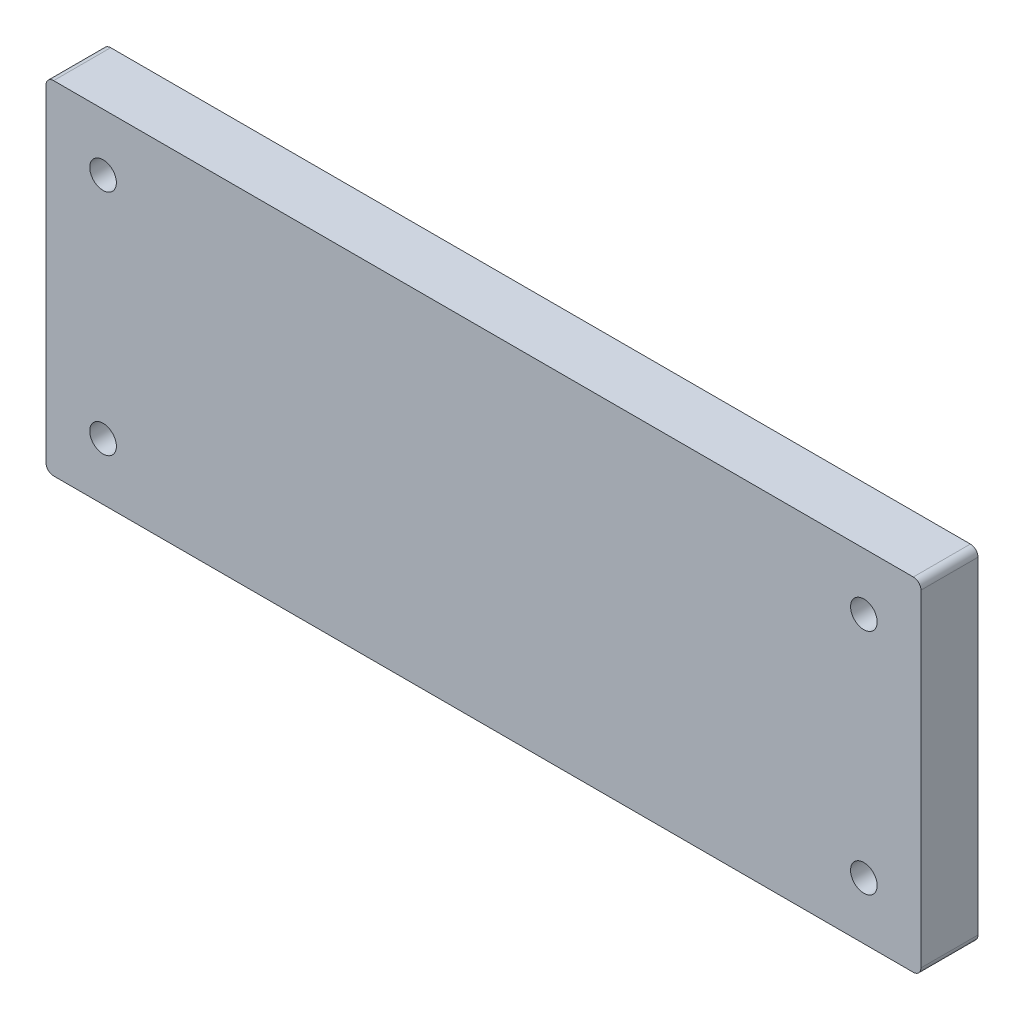
ISO-10303-21;
HEADER;
FILE_DESCRIPTION(('STEP AP214'),'2;1');
FILE_NAME('part.step','',(''),(''),'','','');
FILE_SCHEMA(('AUTOMOTIVE_DESIGN { 1 0 10303 214 1 1 1 1 }'));
ENDSEC;
DATA;
#1=APPLICATION_CONTEXT('core data for automotive mechanical design processes');
#2=APPLICATION_PROTOCOL_DEFINITION('international standard','automotive_design',2000,#1);
#3=PRODUCT_CONTEXT('',#1,'mechanical');
#4=PRODUCT('Part','Part','',(#3));
#5=PRODUCT_RELATED_PRODUCT_CATEGORY('part','',(#4));
#6=PRODUCT_DEFINITION_FORMATION('','',#4);
#7=PRODUCT_DEFINITION_CONTEXT('part definition',#1,'design');
#8=PRODUCT_DEFINITION('design','',#6,#7);
#9=PRODUCT_DEFINITION_SHAPE('','',#8);
#10=(LENGTH_UNIT() NAMED_UNIT(*) SI_UNIT(.MILLI.,.METRE.));
#11=(NAMED_UNIT(*) PLANE_ANGLE_UNIT() SI_UNIT($,.RADIAN.));
#12=(NAMED_UNIT(*) SI_UNIT($,.STERADIAN.) SOLID_ANGLE_UNIT());
#13=UNCERTAINTY_MEASURE_WITH_UNIT(LENGTH_MEASURE(1.E-05),#10,'distance_accuracy_value','');
#14=(GEOMETRIC_REPRESENTATION_CONTEXT(3) GLOBAL_UNCERTAINTY_ASSIGNED_CONTEXT((#13)) GLOBAL_UNIT_ASSIGNED_CONTEXT((#10,
#11,#12)) REPRESENTATION_CONTEXT('',''));
#15=CARTESIAN_POINT('',(0.,0.,0.));
#16=DIRECTION('',(0.,0.,1.));
#17=DIRECTION('',(1.,0.,0.));
#18=AXIS2_PLACEMENT_3D('',#15,#16,#17);
#19=CARTESIAN_POINT('',(-115.,45.,15.));
#20=DIRECTION('',(1.,0.,0.));
#21=DIRECTION('',(0.,1.,0.));
#22=AXIS2_PLACEMENT_3D('',#19,#20,#21);
#23=PLANE('',#22);
#24=DIRECTION('',(0.,-1.,0.));
#25=VECTOR('',#24,1.);
#26=CARTESIAN_POINT('',(-115.,45.,0.));
#27=LINE('',#26,#25);
#28=CARTESIAN_POINT('',(-115.,43.,0.));
#29=VERTEX_POINT('',#28);
#30=CARTESIAN_POINT('',(-115.,-43.,0.));
#31=VERTEX_POINT('',#30);
#32=EDGE_CURVE('E176',#29,#31,#27,.T.);
#33=ORIENTED_EDGE('',*,*,#32,.T.);
#34=DIRECTION('',(0.,0.,-1.));
#35=VECTOR('',#34,1.);
#36=CARTESIAN_POINT('',(-115.,-43.,15.));
#37=LINE('',#36,#35);
#38=CARTESIAN_POINT('',(-115.,-43.,15.));
#39=VERTEX_POINT('',#38);
#40=EDGE_CURVE('E11',#31,#39,#37,.F.);
#41=ORIENTED_EDGE('',*,*,#40,.T.);
#42=DIRECTION('',(0.,-1.,0.));
#43=VECTOR('',#42,1.);
#44=CARTESIAN_POINT('',(-115.,45.,15.));
#45=LINE('',#44,#43);
#46=CARTESIAN_POINT('',(-115.,43.,15.));
#47=VERTEX_POINT('',#46);
#48=EDGE_CURVE('E130',#47,#39,#45,.T.);
#49=ORIENTED_EDGE('',*,*,#48,.F.);
#50=DIRECTION('',(0.,0.,-1.));
#51=VECTOR('',#50,1.);
#52=CARTESIAN_POINT('',(-115.,43.,15.));
#53=LINE('',#52,#51);
#54=EDGE_CURVE('E147',#47,#29,#53,.T.);
#55=ORIENTED_EDGE('',*,*,#54,.T.);
#56=EDGE_LOOP('',(#33,#41,#49,#55));
#57=FACE_BOUND('',#56,.T.);
#58=ADVANCED_FACE('F37',(#57),#23,.F.);
#59=CARTESIAN_POINT('',(-115.,-45.,15.));
#60=DIRECTION('',(0.,1.,0.));
#61=DIRECTION('',(0.,0.,1.));
#62=AXIS2_PLACEMENT_3D('',#59,#60,#61);
#63=PLANE('',#62);
#64=DIRECTION('',(1.,0.,0.));
#65=VECTOR('',#64,1.);
#66=CARTESIAN_POINT('',(-115.,-45.,0.));
#67=LINE('',#66,#65);
#68=CARTESIAN_POINT('',(-113.,-45.,0.));
#69=VERTEX_POINT('',#68);
#70=CARTESIAN_POINT('',(113.,-45.,0.));
#71=VERTEX_POINT('',#70);
#72=EDGE_CURVE('E136',#69,#71,#67,.T.);
#73=ORIENTED_EDGE('',*,*,#72,.T.);
#74=DIRECTION('',(0.,0.,-1.));
#75=VECTOR('',#74,1.);
#76=CARTESIAN_POINT('',(113.,-45.,15.));
#77=LINE('',#76,#75);
#78=CARTESIAN_POINT('',(113.,-45.,15.));
#79=VERTEX_POINT('',#78);
#80=EDGE_CURVE('E58',#71,#79,#77,.F.);
#81=ORIENTED_EDGE('',*,*,#80,.T.);
#82=DIRECTION('',(1.,0.,0.));
#83=VECTOR('',#82,1.);
#84=CARTESIAN_POINT('',(-115.,-45.,15.));
#85=LINE('',#84,#83);
#86=CARTESIAN_POINT('',(-113.,-45.,15.));
#87=VERTEX_POINT('',#86);
#88=EDGE_CURVE('E134',#87,#79,#85,.T.);
#89=ORIENTED_EDGE('',*,*,#88,.F.);
#90=DIRECTION('',(0.,0.,-1.));
#91=VECTOR('',#90,1.);
#92=CARTESIAN_POINT('',(-113.,-45.,15.));
#93=LINE('',#92,#91);
#94=EDGE_CURVE('E157',#87,#69,#93,.T.);
#95=ORIENTED_EDGE('',*,*,#94,.T.);
#96=EDGE_LOOP('',(#73,#81,#89,#95));
#97=FACE_BOUND('',#96,.T.);
#98=ADVANCED_FACE('F174',(#97),#63,.F.);
#99=CARTESIAN_POINT('',(115.,45.,15.));
#100=DIRECTION('',(-1.,0.,0.));
#101=DIRECTION('',(0.,-1.,0.));
#102=AXIS2_PLACEMENT_3D('',#99,#100,#101);
#103=PLANE('',#102);
#104=DIRECTION('',(0.,1.,0.));
#105=VECTOR('',#104,1.);
#106=CARTESIAN_POINT('',(115.,45.,15.));
#107=LINE('',#106,#105);
#108=CARTESIAN_POINT('',(115.,-43.,15.));
#109=VERTEX_POINT('',#108);
#110=CARTESIAN_POINT('',(115.,43.,15.));
#111=VERTEX_POINT('',#110);
#112=EDGE_CURVE('E166',#109,#111,#107,.T.);
#113=ORIENTED_EDGE('',*,*,#112,.F.);
#114=DIRECTION('',(0.,0.,-1.));
#115=VECTOR('',#114,1.);
#116=CARTESIAN_POINT('',(115.,-43.,15.));
#117=LINE('',#116,#115);
#118=CARTESIAN_POINT('',(115.,-43.,0.));
#119=VERTEX_POINT('',#118);
#120=EDGE_CURVE('E150',#109,#119,#117,.T.);
#121=ORIENTED_EDGE('',*,*,#120,.T.);
#122=DIRECTION('',(0.,1.,0.));
#123=VECTOR('',#122,1.);
#124=CARTESIAN_POINT('',(115.,45.,0.));
#125=LINE('',#124,#123);
#126=CARTESIAN_POINT('',(115.,43.,0.));
#127=VERTEX_POINT('',#126);
#128=EDGE_CURVE('E131',#119,#127,#125,.T.);
#129=ORIENTED_EDGE('',*,*,#128,.T.);
#130=DIRECTION('',(0.,0.,-1.));
#131=VECTOR('',#130,1.);
#132=CARTESIAN_POINT('',(115.,43.,15.));
#133=LINE('',#132,#131);
#134=EDGE_CURVE('E111',#127,#111,#133,.F.);
#135=ORIENTED_EDGE('',*,*,#134,.T.);
#136=EDGE_LOOP('',(#113,#121,#129,#135));
#137=FACE_BOUND('',#136,.T.);
#138=ADVANCED_FACE('F170',(#137),#103,.F.);
#139=CARTESIAN_POINT('',(-115.,45.,15.));
#140=DIRECTION('',(0.,-1.,0.));
#141=DIRECTION('',(1.,0.,0.));
#142=AXIS2_PLACEMENT_3D('',#139,#140,#141);
#143=PLANE('',#142);
#144=DIRECTION('',(-1.,0.,0.));
#145=VECTOR('',#144,1.);
#146=CARTESIAN_POINT('',(-115.,45.,15.));
#147=LINE('',#146,#145);
#148=CARTESIAN_POINT('',(113.,45.,15.));
#149=VERTEX_POINT('',#148);
#150=CARTESIAN_POINT('',(-113.,45.,15.));
#151=VERTEX_POINT('',#150);
#152=EDGE_CURVE('E124',#149,#151,#147,.T.);
#153=ORIENTED_EDGE('',*,*,#152,.F.);
#154=DIRECTION('',(0.,0.,-1.));
#155=VECTOR('',#154,1.);
#156=CARTESIAN_POINT('',(113.,45.,15.));
#157=LINE('',#156,#155);
#158=CARTESIAN_POINT('',(113.,45.,0.));
#159=VERTEX_POINT('',#158);
#160=EDGE_CURVE('E109',#149,#159,#157,.T.);
#161=ORIENTED_EDGE('',*,*,#160,.T.);
#162=DIRECTION('',(-1.,0.,0.));
#163=VECTOR('',#162,1.);
#164=CARTESIAN_POINT('',(-115.,45.,0.));
#165=LINE('',#164,#163);
#166=CARTESIAN_POINT('',(-113.,45.,0.));
#167=VERTEX_POINT('',#166);
#168=EDGE_CURVE('E121',#159,#167,#165,.T.);
#169=ORIENTED_EDGE('',*,*,#168,.T.);
#170=DIRECTION('',(0.,0.,-1.));
#171=VECTOR('',#170,1.);
#172=CARTESIAN_POINT('',(-113.,45.,15.));
#173=LINE('',#172,#171);
#174=EDGE_CURVE('E125',#167,#151,#173,.F.);
#175=ORIENTED_EDGE('',*,*,#174,.T.);
#176=EDGE_LOOP('',(#153,#161,#169,#175));
#177=FACE_BOUND('',#176,.T.);
#178=ADVANCED_FACE('F120',(#177),#143,.F.);
#179=CARTESIAN_POINT('',(0.,0.,15.));
#180=DIRECTION('',(0.,0.,1.));
#181=DIRECTION('',(1.,0.,0.));
#182=AXIS2_PLACEMENT_3D('',#179,#180,#181);
#183=PLANE('',#182);
#184=CARTESIAN_POINT('',(100.,-30.,15.));
#185=DIRECTION('',(0.,0.,1.));
#186=DIRECTION('',(1.,0.,0.));
#187=AXIS2_PLACEMENT_3D('',#184,#185,#186);
#188=CIRCLE('',#187,3.49999999999999);
#189=CARTESIAN_POINT('',(103.5,-30.,15.));
#190=VERTEX_POINT('',#189);
#191=EDGE_CURVE('E202',#190,#190,#188,.T.);
#192=ORIENTED_EDGE('',*,*,#191,.F.);
#193=EDGE_LOOP('',(#192));
#194=FACE_BOUND('',#193,.T.);
#195=CARTESIAN_POINT('',(-100.,-30.,15.));
#196=DIRECTION('',(0.,0.,1.));
#197=DIRECTION('',(1.,0.,0.));
#198=AXIS2_PLACEMENT_3D('',#195,#196,#197);
#199=CIRCLE('',#198,3.49999999999999);
#200=CARTESIAN_POINT('',(-96.5,-30.,15.));
#201=VERTEX_POINT('',#200);
#202=EDGE_CURVE('E196',#201,#201,#199,.T.);
#203=ORIENTED_EDGE('',*,*,#202,.F.);
#204=EDGE_LOOP('',(#203));
#205=FACE_BOUND('',#204,.T.);
#206=CARTESIAN_POINT('',(-100.,30.,15.));
#207=DIRECTION('',(0.,0.,1.));
#208=DIRECTION('',(1.,0.,0.));
#209=AXIS2_PLACEMENT_3D('',#206,#207,#208);
#210=CIRCLE('',#209,3.49999999999999);
#211=CARTESIAN_POINT('',(-96.5,30.,15.));
#212=VERTEX_POINT('',#211);
#213=EDGE_CURVE('E190',#212,#212,#210,.T.);
#214=ORIENTED_EDGE('',*,*,#213,.F.);
#215=EDGE_LOOP('',(#214));
#216=FACE_BOUND('',#215,.T.);
#217=CARTESIAN_POINT('',(100.,30.,15.));
#218=DIRECTION('',(0.,0.,1.));
#219=DIRECTION('',(1.,0.,0.));
#220=AXIS2_PLACEMENT_3D('',#217,#218,#219);
#221=CIRCLE('',#220,3.49999999999999);
#222=CARTESIAN_POINT('',(103.5,30.,15.));
#223=VERTEX_POINT('',#222);
#224=EDGE_CURVE('E184',#223,#223,#221,.T.);
#225=ORIENTED_EDGE('',*,*,#224,.F.);
#226=EDGE_LOOP('',(#225));
#227=FACE_BOUND('',#226,.T.);
#228=ORIENTED_EDGE('',*,*,#88,.T.);
#229=CARTESIAN_POINT('',(113.,-43.,15.));
#230=DIRECTION('',(0.,0.,1.));
#231=DIRECTION('',(1.,0.,0.));
#232=AXIS2_PLACEMENT_3D('',#229,#230,#231);
#233=CIRCLE('',#232,2.);
#234=EDGE_CURVE('E45',#79,#109,#233,.T.);
#235=ORIENTED_EDGE('',*,*,#234,.T.);
#236=ORIENTED_EDGE('',*,*,#112,.T.);
#237=CARTESIAN_POINT('',(113.,43.,15.));
#238=DIRECTION('',(0.,0.,1.));
#239=DIRECTION('',(1.,0.,0.));
#240=AXIS2_PLACEMENT_3D('',#237,#238,#239);
#241=CIRCLE('',#240,2.);
#242=EDGE_CURVE('E145',#111,#149,#241,.T.);
#243=ORIENTED_EDGE('',*,*,#242,.T.);
#244=ORIENTED_EDGE('',*,*,#152,.T.);
#245=CARTESIAN_POINT('',(-113.,43.,15.));
#246=DIRECTION('',(0.,0.,1.));
#247=DIRECTION('',(1.,0.,0.));
#248=AXIS2_PLACEMENT_3D('',#245,#246,#247);
#249=CIRCLE('',#248,2.);
#250=EDGE_CURVE('E143',#151,#47,#249,.T.);
#251=ORIENTED_EDGE('',*,*,#250,.T.);
#252=ORIENTED_EDGE('',*,*,#48,.T.);
#253=CARTESIAN_POINT('',(-113.,-43.,15.));
#254=DIRECTION('',(0.,0.,1.));
#255=DIRECTION('',(1.,0.,0.));
#256=AXIS2_PLACEMENT_3D('',#253,#254,#255);
#257=CIRCLE('',#256,2.);
#258=EDGE_CURVE('E161',#39,#87,#257,.T.);
#259=ORIENTED_EDGE('',*,*,#258,.T.);
#260=EDGE_LOOP('',(#228,#235,#236,#243,#244,#251,#252,#259));
#261=FACE_BOUND('',#260,.T.);
#262=ADVANCED_FACE('F165',(#194,#205,#216,#227,#261),#183,.T.);
#263=CARTESIAN_POINT('',(0.,0.,0.));
#264=DIRECTION('',(0.,0.,1.));
#265=DIRECTION('',(1.,0.,0.));
#266=AXIS2_PLACEMENT_3D('',#263,#264,#265);
#267=PLANE('',#266);
#268=CARTESIAN_POINT('',(100.,-30.,0.));
#269=DIRECTION('',(0.,0.,1.));
#270=DIRECTION('',(1.,0.,0.));
#271=AXIS2_PLACEMENT_3D('',#268,#269,#270);
#272=CIRCLE('',#271,3.49999999999999);
#273=CARTESIAN_POINT('',(103.5,-30.,0.));
#274=VERTEX_POINT('',#273);
#275=EDGE_CURVE('E199',#274,#274,#272,.T.);
#276=ORIENTED_EDGE('',*,*,#275,.T.);
#277=EDGE_LOOP('',(#276));
#278=FACE_BOUND('',#277,.T.);
#279=CARTESIAN_POINT('',(-100.,-30.,0.));
#280=DIRECTION('',(0.,0.,1.));
#281=DIRECTION('',(1.,0.,0.));
#282=AXIS2_PLACEMENT_3D('',#279,#280,#281);
#283=CIRCLE('',#282,3.49999999999999);
#284=CARTESIAN_POINT('',(-96.5,-30.,0.));
#285=VERTEX_POINT('',#284);
#286=EDGE_CURVE('E193',#285,#285,#283,.T.);
#287=ORIENTED_EDGE('',*,*,#286,.T.);
#288=EDGE_LOOP('',(#287));
#289=FACE_BOUND('',#288,.T.);
#290=CARTESIAN_POINT('',(-100.,30.,0.));
#291=DIRECTION('',(0.,0.,1.));
#292=DIRECTION('',(1.,0.,0.));
#293=AXIS2_PLACEMENT_3D('',#290,#291,#292);
#294=CIRCLE('',#293,3.49999999999999);
#295=CARTESIAN_POINT('',(-96.5,30.,0.));
#296=VERTEX_POINT('',#295);
#297=EDGE_CURVE('E187',#296,#296,#294,.T.);
#298=ORIENTED_EDGE('',*,*,#297,.T.);
#299=EDGE_LOOP('',(#298));
#300=FACE_BOUND('',#299,.T.);
#301=CARTESIAN_POINT('',(100.,30.,0.));
#302=DIRECTION('',(0.,0.,1.));
#303=DIRECTION('',(1.,0.,0.));
#304=AXIS2_PLACEMENT_3D('',#301,#302,#303);
#305=CIRCLE('',#304,3.49999999999999);
#306=CARTESIAN_POINT('',(103.5,30.,0.));
#307=VERTEX_POINT('',#306);
#308=EDGE_CURVE('E177',#307,#307,#305,.T.);
#309=ORIENTED_EDGE('',*,*,#308,.T.);
#310=EDGE_LOOP('',(#309));
#311=FACE_BOUND('',#310,.T.);
#312=ORIENTED_EDGE('',*,*,#128,.F.);
#313=CARTESIAN_POINT('',(113.,-43.,0.));
#314=DIRECTION('',(0.,0.,1.));
#315=DIRECTION('',(1.,0.,0.));
#316=AXIS2_PLACEMENT_3D('',#313,#314,#315);
#317=CIRCLE('',#316,2.);
#318=EDGE_CURVE('E155',#119,#71,#317,.F.);
#319=ORIENTED_EDGE('',*,*,#318,.T.);
#320=ORIENTED_EDGE('',*,*,#72,.F.);
#321=CARTESIAN_POINT('',(-113.,-43.,0.));
#322=DIRECTION('',(0.,0.,1.));
#323=DIRECTION('',(1.,0.,0.));
#324=AXIS2_PLACEMENT_3D('',#321,#322,#323);
#325=CIRCLE('',#324,2.);
#326=EDGE_CURVE('E153',#69,#31,#325,.F.);
#327=ORIENTED_EDGE('',*,*,#326,.T.);
#328=ORIENTED_EDGE('',*,*,#32,.F.);
#329=CARTESIAN_POINT('',(-113.,43.,0.));
#330=DIRECTION('',(0.,0.,1.));
#331=DIRECTION('',(1.,0.,0.));
#332=AXIS2_PLACEMENT_3D('',#329,#330,#331);
#333=CIRCLE('',#332,2.);
#334=EDGE_CURVE('E115',#29,#167,#333,.F.);
#335=ORIENTED_EDGE('',*,*,#334,.T.);
#336=ORIENTED_EDGE('',*,*,#168,.F.);
#337=CARTESIAN_POINT('',(113.,43.,0.));
#338=DIRECTION('',(0.,0.,1.));
#339=DIRECTION('',(1.,0.,0.));
#340=AXIS2_PLACEMENT_3D('',#337,#338,#339);
#341=CIRCLE('',#340,2.);
#342=EDGE_CURVE('E105',#159,#127,#341,.F.);
#343=ORIENTED_EDGE('',*,*,#342,.T.);
#344=EDGE_LOOP('',(#312,#319,#320,#327,#328,#335,#336,#343));
#345=FACE_BOUND('',#344,.T.);
#346=ADVANCED_FACE('F127',(#278,#289,#300,#311,#345),#267,.F.);
#347=CARTESIAN_POINT('',(100.,30.,15.));
#348=DIRECTION('',(0.,0.,1.));
#349=DIRECTION('',(1.,0.,0.));
#350=AXIS2_PLACEMENT_3D('',#347,#348,#349);
#351=CYLINDRICAL_SURFACE('',#350,3.49999999999999);
#352=ORIENTED_EDGE('',*,*,#308,.F.);
#353=EDGE_LOOP('',(#352));
#354=FACE_BOUND('',#353,.T.);
#355=ORIENTED_EDGE('',*,*,#224,.T.);
#356=EDGE_LOOP('',(#355));
#357=FACE_BOUND('',#356,.T.);
#358=ADVANCED_FACE('F217',(#354,#357),#351,.F.);
#359=CARTESIAN_POINT('',(-100.,30.,15.));
#360=DIRECTION('',(0.,0.,1.));
#361=DIRECTION('',(1.,0.,0.));
#362=AXIS2_PLACEMENT_3D('',#359,#360,#361);
#363=CYLINDRICAL_SURFACE('',#362,3.49999999999999);
#364=ORIENTED_EDGE('',*,*,#297,.F.);
#365=EDGE_LOOP('',(#364));
#366=FACE_BOUND('',#365,.T.);
#367=ORIENTED_EDGE('',*,*,#213,.T.);
#368=EDGE_LOOP('',(#367));
#369=FACE_BOUND('',#368,.T.);
#370=ADVANCED_FACE('F219',(#366,#369),#363,.F.);
#371=CARTESIAN_POINT('',(-100.,-30.,15.));
#372=DIRECTION('',(0.,0.,1.));
#373=DIRECTION('',(1.,0.,0.));
#374=AXIS2_PLACEMENT_3D('',#371,#372,#373);
#375=CYLINDRICAL_SURFACE('',#374,3.49999999999999);
#376=ORIENTED_EDGE('',*,*,#286,.F.);
#377=EDGE_LOOP('',(#376));
#378=FACE_BOUND('',#377,.T.);
#379=ORIENTED_EDGE('',*,*,#202,.T.);
#380=EDGE_LOOP('',(#379));
#381=FACE_BOUND('',#380,.T.);
#382=ADVANCED_FACE('F226',(#378,#381),#375,.F.);
#383=CARTESIAN_POINT('',(100.,-30.,15.));
#384=DIRECTION('',(0.,0.,1.));
#385=DIRECTION('',(1.,0.,0.));
#386=AXIS2_PLACEMENT_3D('',#383,#384,#385);
#387=CYLINDRICAL_SURFACE('',#386,3.49999999999999);
#388=ORIENTED_EDGE('',*,*,#275,.F.);
#389=EDGE_LOOP('',(#388));
#390=FACE_BOUND('',#389,.T.);
#391=ORIENTED_EDGE('',*,*,#191,.T.);
#392=EDGE_LOOP('',(#391));
#393=FACE_BOUND('',#392,.T.);
#394=ADVANCED_FACE('F206',(#390,#393),#387,.F.);
#395=CARTESIAN_POINT('',(113.,43.,15.));
#396=DIRECTION('',(0.,0.,-1.));
#397=DIRECTION('',(-1.,0.,0.));
#398=AXIS2_PLACEMENT_3D('',#395,#396,#397);
#399=CYLINDRICAL_SURFACE('',#398,2.);
#400=ORIENTED_EDGE('',*,*,#242,.F.);
#401=ORIENTED_EDGE('',*,*,#134,.F.);
#402=ORIENTED_EDGE('',*,*,#342,.F.);
#403=ORIENTED_EDGE('',*,*,#160,.F.);
#404=EDGE_LOOP('',(#400,#401,#402,#403));
#405=FACE_BOUND('',#404,.T.);
#406=ADVANCED_FACE('F108',(#405),#399,.T.);
#407=CARTESIAN_POINT('',(-113.,43.,15.));
#408=DIRECTION('',(0.,0.,-1.));
#409=DIRECTION('',(-1.,0.,0.));
#410=AXIS2_PLACEMENT_3D('',#407,#408,#409);
#411=CYLINDRICAL_SURFACE('',#410,2.);
#412=ORIENTED_EDGE('',*,*,#250,.F.);
#413=ORIENTED_EDGE('',*,*,#174,.F.);
#414=ORIENTED_EDGE('',*,*,#334,.F.);
#415=ORIENTED_EDGE('',*,*,#54,.F.);
#416=EDGE_LOOP('',(#412,#413,#414,#415));
#417=FACE_BOUND('',#416,.T.);
#418=ADVANCED_FACE('F242',(#417),#411,.T.);
#419=CARTESIAN_POINT('',(113.,-43.,15.));
#420=DIRECTION('',(0.,0.,-1.));
#421=DIRECTION('',(-1.,0.,0.));
#422=AXIS2_PLACEMENT_3D('',#419,#420,#421);
#423=CYLINDRICAL_SURFACE('',#422,2.);
#424=ORIENTED_EDGE('',*,*,#234,.F.);
#425=ORIENTED_EDGE('',*,*,#80,.F.);
#426=ORIENTED_EDGE('',*,*,#318,.F.);
#427=ORIENTED_EDGE('',*,*,#120,.F.);
#428=EDGE_LOOP('',(#424,#425,#426,#427));
#429=FACE_BOUND('',#428,.T.);
#430=ADVANCED_FACE('F172',(#429),#423,.T.);
#431=CARTESIAN_POINT('',(-113.,-43.,15.));
#432=DIRECTION('',(0.,0.,-1.));
#433=DIRECTION('',(-1.,0.,0.));
#434=AXIS2_PLACEMENT_3D('',#431,#432,#433);
#435=CYLINDRICAL_SURFACE('',#434,2.);
#436=ORIENTED_EDGE('',*,*,#258,.F.);
#437=ORIENTED_EDGE('',*,*,#40,.F.);
#438=ORIENTED_EDGE('',*,*,#326,.F.);
#439=ORIENTED_EDGE('',*,*,#94,.F.);
#440=EDGE_LOOP('',(#436,#437,#438,#439));
#441=FACE_BOUND('',#440,.T.);
#442=ADVANCED_FACE('F39',(#441),#435,.T.);
#443=CLOSED_SHELL('',(#58,#98,#138,#178,#262,#346,#358,#370,#382,#394,#406,#418,#430,#442));
#444=MANIFOLD_SOLID_BREP('B2',#443);
#445=ADVANCED_BREP_SHAPE_REPRESENTATION('',(#18,#444),#14);
#446=SHAPE_DEFINITION_REPRESENTATION(#9,#445);
ENDSEC;
END-ISO-10303-21;
